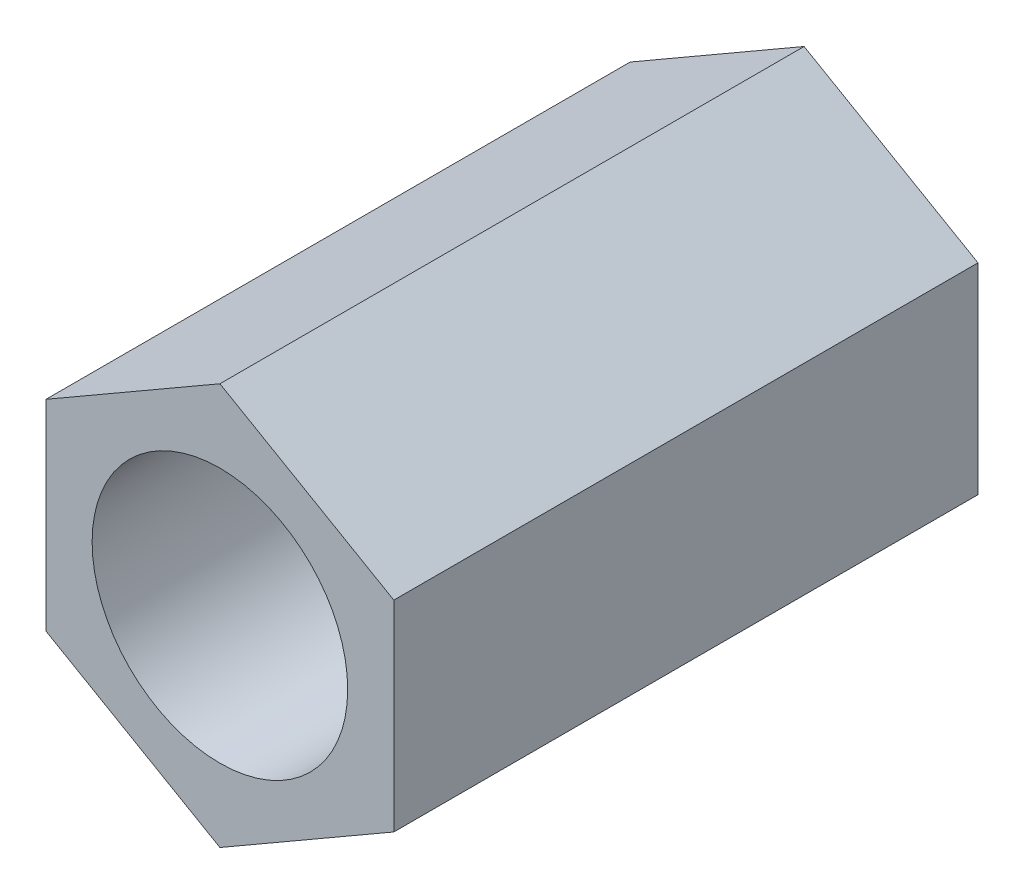
ISO-10303-21;
HEADER;
FILE_DESCRIPTION(('STEP AP214'),'2;1');
FILE_NAME('part.step','',(''),(''),'','','');
FILE_SCHEMA(('AUTOMOTIVE_DESIGN { 1 0 10303 214 1 1 1 1 }'));
ENDSEC;
DATA;
#1=APPLICATION_CONTEXT('core data for automotive mechanical design processes');
#2=APPLICATION_PROTOCOL_DEFINITION('international standard','automotive_design',2000,#1);
#3=PRODUCT_CONTEXT('',#1,'mechanical');
#4=PRODUCT('Part','Part','',(#3));
#5=PRODUCT_RELATED_PRODUCT_CATEGORY('part','',(#4));
#6=PRODUCT_DEFINITION_FORMATION('','',#4);
#7=PRODUCT_DEFINITION_CONTEXT('part definition',#1,'design');
#8=PRODUCT_DEFINITION('design','',#6,#7);
#9=PRODUCT_DEFINITION_SHAPE('','',#8);
#10=(LENGTH_UNIT() NAMED_UNIT(*) SI_UNIT(.MILLI.,.METRE.));
#11=(NAMED_UNIT(*) PLANE_ANGLE_UNIT() SI_UNIT($,.RADIAN.));
#12=(NAMED_UNIT(*) SI_UNIT($,.STERADIAN.) SOLID_ANGLE_UNIT());
#13=UNCERTAINTY_MEASURE_WITH_UNIT(LENGTH_MEASURE(1.E-05),#10,'distance_accuracy_value','');
#14=(GEOMETRIC_REPRESENTATION_CONTEXT(3) GLOBAL_UNCERTAINTY_ASSIGNED_CONTEXT((#13)) GLOBAL_UNIT_ASSIGNED_CONTEXT((#10,
#11,#12)) REPRESENTATION_CONTEXT('',''));
#15=CARTESIAN_POINT('',(0.,0.,0.));
#16=DIRECTION('',(0.,0.,1.));
#17=DIRECTION('',(1.,0.,0.));
#18=AXIS2_PLACEMENT_3D('',#15,#16,#17);
#19=CARTESIAN_POINT('',(2.38156986040719,1.37500000000003,8.));
#20=DIRECTION('',(-0.499999999999995,-0.866025403784442,0.));
#21=DIRECTION('',(0.866025403784442,-0.499999999999995,0.));
#22=AXIS2_PLACEMENT_3D('',#19,#20,#21);
#23=PLANE('',#22);
#24=DIRECTION('',(-0.866025403784442,0.499999999999995,0.));
#25=VECTOR('',#24,1.);
#26=CARTESIAN_POINT('',(2.38156986040719,1.37500000000003,0.));
#27=LINE('',#26,#25);
#28=CARTESIAN_POINT('',(2.38156986040719,1.37500000000003,0.));
#29=VERTEX_POINT('',#28);
#30=CARTESIAN_POINT('',(0.,2.75,0.));
#31=VERTEX_POINT('',#30);
#32=EDGE_CURVE('E114',#29,#31,#27,.T.);
#33=ORIENTED_EDGE('',*,*,#32,.T.);
#34=DIRECTION('',(0.,0.,-1.));
#35=VECTOR('',#34,1.);
#36=CARTESIAN_POINT('',(0.,2.75,8.));
#37=LINE('',#36,#35);
#38=CARTESIAN_POINT('',(0.,2.75,8.));
#39=VERTEX_POINT('',#38);
#40=EDGE_CURVE('E11',#39,#31,#37,.T.);
#41=ORIENTED_EDGE('',*,*,#40,.F.);
#42=DIRECTION('',(-0.866025403784442,0.499999999999995,0.));
#43=VECTOR('',#42,1.);
#44=CARTESIAN_POINT('',(2.38156986040719,1.37500000000003,8.));
#45=LINE('',#44,#43);
#46=CARTESIAN_POINT('',(2.38156986040719,1.37500000000003,8.));
#47=VERTEX_POINT('',#46);
#48=EDGE_CURVE('E125',#47,#39,#45,.T.);
#49=ORIENTED_EDGE('',*,*,#48,.F.);
#50=DIRECTION('',(0.,0.,-1.));
#51=VECTOR('',#50,1.);
#52=CARTESIAN_POINT('',(2.38156986040719,1.37500000000003,8.));
#53=LINE('',#52,#51);
#54=EDGE_CURVE('E110',#47,#29,#53,.T.);
#55=ORIENTED_EDGE('',*,*,#54,.T.);
#56=EDGE_LOOP('',(#33,#41,#49,#55));
#57=FACE_BOUND('',#56,.T.);
#58=ADVANCED_FACE('F30',(#57),#23,.F.);
#59=CARTESIAN_POINT('',(0.,2.75,8.));
#60=DIRECTION('',(0.500000000000001,-0.866025403784438,0.));
#61=DIRECTION('',(0.866025403784438,0.500000000000001,0.));
#62=AXIS2_PLACEMENT_3D('',#59,#60,#61);
#63=PLANE('',#62);
#64=DIRECTION('',(-0.866025403784438,-0.500000000000001,0.));
#65=VECTOR('',#64,1.);
#66=CARTESIAN_POINT('',(0.,2.75,0.));
#67=LINE('',#66,#65);
#68=CARTESIAN_POINT('',(-2.38156986040721,1.37499999999999,0.));
#69=VERTEX_POINT('',#68);
#70=EDGE_CURVE('E117',#31,#69,#67,.T.);
#71=ORIENTED_EDGE('',*,*,#70,.T.);
#72=DIRECTION('',(0.,0.,-1.));
#73=VECTOR('',#72,1.);
#74=CARTESIAN_POINT('',(-2.38156986040721,1.37499999999999,8.));
#75=LINE('',#74,#73);
#76=CARTESIAN_POINT('',(-2.38156986040721,1.37499999999999,8.));
#77=VERTEX_POINT('',#76);
#78=EDGE_CURVE('E38',#77,#69,#75,.T.);
#79=ORIENTED_EDGE('',*,*,#78,.F.);
#80=DIRECTION('',(-0.866025403784438,-0.500000000000001,0.));
#81=VECTOR('',#80,1.);
#82=CARTESIAN_POINT('',(0.,2.75,8.));
#83=LINE('',#82,#81);
#84=EDGE_CURVE('E83',#39,#77,#83,.T.);
#85=ORIENTED_EDGE('',*,*,#84,.F.);
#86=ORIENTED_EDGE('',*,*,#40,.T.);
#87=EDGE_LOOP('',(#71,#79,#85,#86));
#88=FACE_BOUND('',#87,.T.);
#89=ADVANCED_FACE('F151',(#88),#63,.F.);
#90=CARTESIAN_POINT('',(-2.38156986040721,1.37499999999999,8.));
#91=DIRECTION('',(1.,0.,0.));
#92=DIRECTION('',(0.,1.,0.));
#93=AXIS2_PLACEMENT_3D('',#90,#91,#92);
#94=PLANE('',#93);
#95=DIRECTION('',(0.,-1.,0.));
#96=VECTOR('',#95,1.);
#97=CARTESIAN_POINT('',(-2.38156986040721,1.37499999999999,0.));
#98=LINE('',#97,#96);
#99=CARTESIAN_POINT('',(-2.3815698604072,-1.37500000000001,0.));
#100=VERTEX_POINT('',#99);
#101=EDGE_CURVE('E120',#69,#100,#98,.T.);
#102=ORIENTED_EDGE('',*,*,#101,.T.);
#103=DIRECTION('',(0.,0.,-1.));
#104=VECTOR('',#103,1.);
#105=CARTESIAN_POINT('',(-2.3815698604072,-1.37500000000001,8.));
#106=LINE('',#105,#104);
#107=CARTESIAN_POINT('',(-2.3815698604072,-1.37500000000001,8.));
#108=VERTEX_POINT('',#107);
#109=EDGE_CURVE('E105',#108,#100,#106,.T.);
#110=ORIENTED_EDGE('',*,*,#109,.F.);
#111=DIRECTION('',(0.,-1.,0.));
#112=VECTOR('',#111,1.);
#113=CARTESIAN_POINT('',(-2.38156986040721,1.37499999999999,8.));
#114=LINE('',#113,#112);
#115=EDGE_CURVE('E96',#77,#108,#114,.T.);
#116=ORIENTED_EDGE('',*,*,#115,.F.);
#117=ORIENTED_EDGE('',*,*,#78,.T.);
#118=EDGE_LOOP('',(#102,#110,#116,#117));
#119=FACE_BOUND('',#118,.T.);
#120=ADVANCED_FACE('F131',(#119),#94,.F.);
#121=CARTESIAN_POINT('',(-2.3815698604072,-1.37500000000001,8.));
#122=DIRECTION('',(0.499999999999995,0.866025403784441,0.));
#123=DIRECTION('',(-0.866025403784442,0.499999999999995,0.));
#124=AXIS2_PLACEMENT_3D('',#121,#122,#123);
#125=PLANE('',#124);
#126=DIRECTION('',(0.866025403784441,-0.499999999999995,0.));
#127=VECTOR('',#126,1.);
#128=CARTESIAN_POINT('',(-2.3815698604072,-1.37500000000001,0.));
#129=LINE('',#128,#127);
#130=CARTESIAN_POINT('',(0.,-2.75,0.));
#131=VERTEX_POINT('',#130);
#132=EDGE_CURVE('E104',#100,#131,#129,.T.);
#133=ORIENTED_EDGE('',*,*,#132,.T.);
#134=DIRECTION('',(0.,0.,-1.));
#135=VECTOR('',#134,1.);
#136=CARTESIAN_POINT('',(0.,-2.75,8.));
#137=LINE('',#136,#135);
#138=CARTESIAN_POINT('',(0.,-2.75,8.));
#139=VERTEX_POINT('',#138);
#140=EDGE_CURVE('E101',#139,#131,#137,.T.);
#141=ORIENTED_EDGE('',*,*,#140,.F.);
#142=DIRECTION('',(0.866025403784441,-0.499999999999995,0.));
#143=VECTOR('',#142,1.);
#144=CARTESIAN_POINT('',(-2.3815698604072,-1.37500000000001,8.));
#145=LINE('',#144,#143);
#146=EDGE_CURVE('E90',#108,#139,#145,.T.);
#147=ORIENTED_EDGE('',*,*,#146,.F.);
#148=ORIENTED_EDGE('',*,*,#109,.T.);
#149=EDGE_LOOP('',(#133,#141,#147,#148));
#150=FACE_BOUND('',#149,.T.);
#151=ADVANCED_FACE('F102',(#150),#125,.F.);
#152=CARTESIAN_POINT('',(0.,-2.75,8.));
#153=DIRECTION('',(-0.500000000000007,0.866025403784435,0.));
#154=DIRECTION('',(-0.866025403784434,-0.500000000000007,0.));
#155=AXIS2_PLACEMENT_3D('',#152,#153,#154);
#156=PLANE('',#155);
#157=DIRECTION('',(0.866025403784434,0.500000000000007,0.));
#158=VECTOR('',#157,1.);
#159=CARTESIAN_POINT('',(0.,-2.75,0.));
#160=LINE('',#159,#158);
#161=CARTESIAN_POINT('',(2.38156986040722,-1.37499999999998,0.));
#162=VERTEX_POINT('',#161);
#163=EDGE_CURVE('E69',#131,#162,#160,.T.);
#164=ORIENTED_EDGE('',*,*,#163,.T.);
#165=DIRECTION('',(0.,0.,-1.));
#166=VECTOR('',#165,1.);
#167=CARTESIAN_POINT('',(2.38156986040722,-1.37499999999998,8.));
#168=LINE('',#167,#166);
#169=CARTESIAN_POINT('',(2.38156986040722,-1.37499999999998,8.));
#170=VERTEX_POINT('',#169);
#171=EDGE_CURVE('E106',#170,#162,#168,.T.);
#172=ORIENTED_EDGE('',*,*,#171,.F.);
#173=DIRECTION('',(0.866025403784434,0.500000000000007,0.));
#174=VECTOR('',#173,1.);
#175=CARTESIAN_POINT('',(0.,-2.75,8.));
#176=LINE('',#175,#174);
#177=EDGE_CURVE('E94',#139,#170,#176,.T.);
#178=ORIENTED_EDGE('',*,*,#177,.F.);
#179=ORIENTED_EDGE('',*,*,#140,.T.);
#180=EDGE_LOOP('',(#164,#172,#178,#179));
#181=FACE_BOUND('',#180,.T.);
#182=ADVANCED_FACE('F108',(#181),#156,.F.);
#183=CARTESIAN_POINT('',(2.38156986040722,-1.37499999999998,8.));
#184=DIRECTION('',(-1.,0.,0.));
#185=DIRECTION('',(0.,-1.,0.));
#186=AXIS2_PLACEMENT_3D('',#183,#184,#185);
#187=PLANE('',#186);
#188=DIRECTION('',(0.,1.,0.));
#189=VECTOR('',#188,1.);
#190=CARTESIAN_POINT('',(2.38156986040722,-1.37499999999998,0.));
#191=LINE('',#190,#189);
#192=EDGE_CURVE('E75',#162,#29,#191,.T.);
#193=ORIENTED_EDGE('',*,*,#192,.T.);
#194=ORIENTED_EDGE('',*,*,#54,.F.);
#195=DIRECTION('',(0.,1.,0.));
#196=VECTOR('',#195,1.);
#197=CARTESIAN_POINT('',(2.38156986040722,-1.37499999999998,8.));
#198=LINE('',#197,#196);
#199=EDGE_CURVE('E46',#170,#47,#198,.T.);
#200=ORIENTED_EDGE('',*,*,#199,.F.);
#201=ORIENTED_EDGE('',*,*,#171,.T.);
#202=EDGE_LOOP('',(#193,#194,#200,#201));
#203=FACE_BOUND('',#202,.T.);
#204=ADVANCED_FACE('F138',(#203),#187,.F.);
#205=CARTESIAN_POINT('',(0.,2.75,8.));
#206=DIRECTION('',(0.,0.,1.));
#207=DIRECTION('',(1.,0.,0.));
#208=AXIS2_PLACEMENT_3D('',#205,#206,#207);
#209=PLANE('',#208);
#210=CARTESIAN_POINT('',(0.,0.,8.));
#211=DIRECTION('',(0.,0.,1.));
#212=DIRECTION('',(1.,0.,0.));
#213=AXIS2_PLACEMENT_3D('',#210,#211,#212);
#214=CIRCLE('',#213,1.75);
#215=CARTESIAN_POINT('',(1.75,0.,8.));
#216=VERTEX_POINT('',#215);
#217=EDGE_CURVE('E205',#216,#216,#214,.T.);
#218=ORIENTED_EDGE('',*,*,#217,.F.);
#219=EDGE_LOOP('',(#218));
#220=FACE_BOUND('',#219,.T.);
#221=ORIENTED_EDGE('',*,*,#48,.T.);
#222=ORIENTED_EDGE('',*,*,#84,.T.);
#223=ORIENTED_EDGE('',*,*,#115,.T.);
#224=ORIENTED_EDGE('',*,*,#146,.T.);
#225=ORIENTED_EDGE('',*,*,#177,.T.);
#226=ORIENTED_EDGE('',*,*,#199,.T.);
#227=EDGE_LOOP('',(#221,#222,#223,#224,#225,#226));
#228=FACE_BOUND('',#227,.T.);
#229=ADVANCED_FACE('F92',(#220,#228),#209,.T.);
#230=CARTESIAN_POINT('',(0.,2.75,0.));
#231=DIRECTION('',(0.,0.,1.));
#232=DIRECTION('',(1.,0.,0.));
#233=AXIS2_PLACEMENT_3D('',#230,#231,#232);
#234=PLANE('',#233);
#235=CARTESIAN_POINT('',(0.,0.,0.));
#236=DIRECTION('',(0.,0.,1.));
#237=DIRECTION('',(1.,0.,0.));
#238=AXIS2_PLACEMENT_3D('',#235,#236,#237);
#239=CIRCLE('',#238,1.75);
#240=CARTESIAN_POINT('',(1.75,0.,0.));
#241=VERTEX_POINT('',#240);
#242=EDGE_CURVE('E118',#241,#241,#239,.T.);
#243=ORIENTED_EDGE('',*,*,#242,.T.);
#244=EDGE_LOOP('',(#243));
#245=FACE_BOUND('',#244,.T.);
#246=ORIENTED_EDGE('',*,*,#32,.F.);
#247=ORIENTED_EDGE('',*,*,#192,.F.);
#248=ORIENTED_EDGE('',*,*,#163,.F.);
#249=ORIENTED_EDGE('',*,*,#132,.F.);
#250=ORIENTED_EDGE('',*,*,#101,.F.);
#251=ORIENTED_EDGE('',*,*,#70,.F.);
#252=EDGE_LOOP('',(#246,#247,#248,#249,#250,#251));
#253=FACE_BOUND('',#252,.T.);
#254=ADVANCED_FACE('F134',(#245,#253),#234,.F.);
#255=CARTESIAN_POINT('',(0.,0.,0.));
#256=DIRECTION('',(0.,0.,1.));
#257=DIRECTION('',(1.,0.,0.));
#258=AXIS2_PLACEMENT_3D('',#255,#256,#257);
#259=CYLINDRICAL_SURFACE('',#258,1.75);
#260=ORIENTED_EDGE('',*,*,#242,.F.);
#261=EDGE_LOOP('',(#260));
#262=FACE_BOUND('',#261,.T.);
#263=ORIENTED_EDGE('',*,*,#217,.T.);
#264=EDGE_LOOP('',(#263));
#265=FACE_BOUND('',#264,.T.);
#266=ADVANCED_FACE('F184',(#262,#265),#259,.F.);
#267=CLOSED_SHELL('',(#58,#89,#120,#151,#182,#204,#229,#254,#266));
#268=MANIFOLD_SOLID_BREP('B2',#267);
#269=ADVANCED_BREP_SHAPE_REPRESENTATION('',(#18,#268),#14);
#270=SHAPE_DEFINITION_REPRESENTATION(#9,#269);
ENDSEC;
END-ISO-10303-21;
